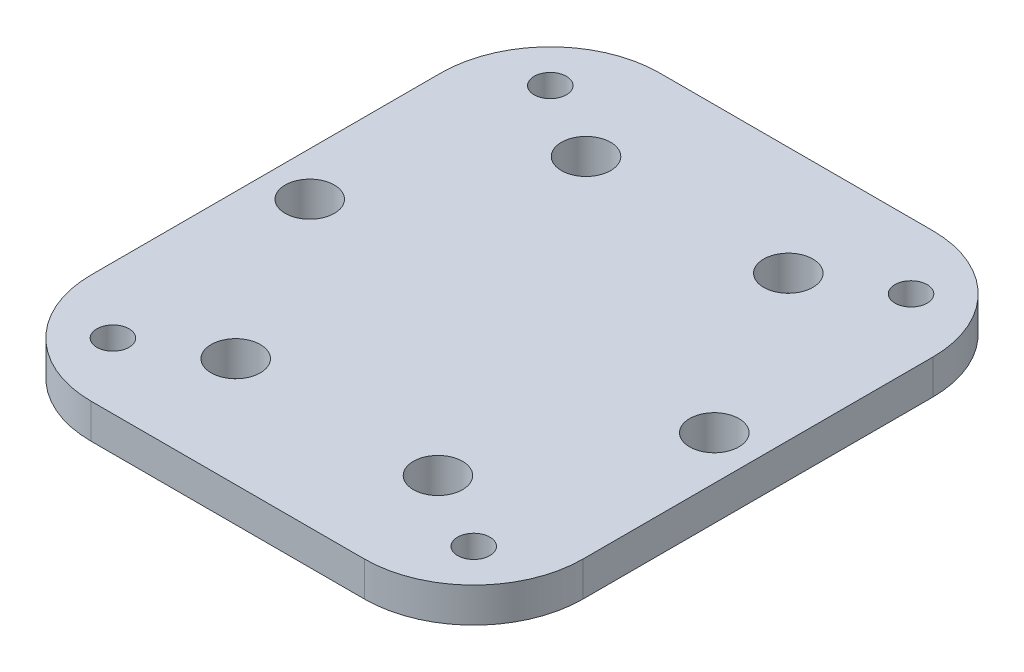
ISO-10303-21;
HEADER;
FILE_DESCRIPTION(('STEP AP214'),'2;1');
FILE_NAME('part.step','',(''),(''),'','','');
FILE_SCHEMA(('AUTOMOTIVE_DESIGN { 1 0 10303 214 1 1 1 1 }'));
ENDSEC;
DATA;
#1=APPLICATION_CONTEXT('core data for automotive mechanical design processes');
#2=APPLICATION_PROTOCOL_DEFINITION('international standard','automotive_design',2000,#1);
#3=PRODUCT_CONTEXT('',#1,'mechanical');
#4=PRODUCT('Part','Part','',(#3));
#5=PRODUCT_RELATED_PRODUCT_CATEGORY('part','',(#4));
#6=PRODUCT_DEFINITION_FORMATION('','',#4);
#7=PRODUCT_DEFINITION_CONTEXT('part definition',#1,'design');
#8=PRODUCT_DEFINITION('design','',#6,#7);
#9=PRODUCT_DEFINITION_SHAPE('','',#8);
#10=(LENGTH_UNIT() NAMED_UNIT(*) SI_UNIT(.MILLI.,.METRE.));
#11=(NAMED_UNIT(*) PLANE_ANGLE_UNIT() SI_UNIT($,.RADIAN.));
#12=(NAMED_UNIT(*) SI_UNIT($,.STERADIAN.) SOLID_ANGLE_UNIT());
#13=UNCERTAINTY_MEASURE_WITH_UNIT(LENGTH_MEASURE(1.E-05),#10,'distance_accuracy_value','');
#14=(GEOMETRIC_REPRESENTATION_CONTEXT(3) GLOBAL_UNCERTAINTY_ASSIGNED_CONTEXT((#13)) GLOBAL_UNIT_ASSIGNED_CONTEXT((#10,
#11,#12)) REPRESENTATION_CONTEXT('',''));
#15=CARTESIAN_POINT('',(0.,0.,0.));
#16=DIRECTION('',(0.,0.,1.));
#17=DIRECTION('',(1.,0.,0.));
#18=AXIS2_PLACEMENT_3D('',#15,#16,#17);
#19=CARTESIAN_POINT('',(-12.5,233.315,-16.));
#20=DIRECTION('',(0.,1.,0.));
#21=DIRECTION('',(0.,0.,1.));
#22=AXIS2_PLACEMENT_3D('',#19,#20,#21);
#23=CYLINDRICAL_SURFACE('',#22,10.);
#24=CARTESIAN_POINT('',(-12.5,236.49,-16.));
#25=DIRECTION('',(0.,1.,0.));
#26=DIRECTION('',(0.,0.,1.));
#27=AXIS2_PLACEMENT_3D('',#24,#25,#26);
#28=CIRCLE('',#27,10.);
#29=CARTESIAN_POINT('',(-12.4999999999999,236.49,-26.));
#30=VERTEX_POINT('',#29);
#31=CARTESIAN_POINT('',(-22.5,236.49,-15.9999999999999));
#32=VERTEX_POINT('',#31);
#33=EDGE_CURVE('E171',#30,#32,#28,.T.);
#34=ORIENTED_EDGE('',*,*,#33,.F.);
#35=DIRECTION('',(0.,1.,0.));
#36=VECTOR('',#35,1.);
#37=CARTESIAN_POINT('',(-12.4999999999999,233.315,-26.));
#38=LINE('',#37,#36);
#39=CARTESIAN_POINT('',(-12.4999999999999,233.315,-26.));
#40=VERTEX_POINT('',#39);
#41=EDGE_CURVE('E11',#40,#30,#38,.T.);
#42=ORIENTED_EDGE('',*,*,#41,.F.);
#43=CARTESIAN_POINT('',(-12.5,233.315,-16.));
#44=DIRECTION('',(0.,1.,0.));
#45=DIRECTION('',(0.,0.,1.));
#46=AXIS2_PLACEMENT_3D('',#43,#44,#45);
#47=CIRCLE('',#46,10.);
#48=CARTESIAN_POINT('',(-22.5,233.315,-15.9999999999999));
#49=VERTEX_POINT('',#48);
#50=EDGE_CURVE('E219',#40,#49,#47,.T.);
#51=ORIENTED_EDGE('',*,*,#50,.T.);
#52=DIRECTION('',(0.,1.,0.));
#53=VECTOR('',#52,1.);
#54=CARTESIAN_POINT('',(-22.5,233.315,-15.9999999999999));
#55=LINE('',#54,#53);
#56=EDGE_CURVE('E44',#49,#32,#55,.T.);
#57=ORIENTED_EDGE('',*,*,#56,.T.);
#58=EDGE_LOOP('',(#34,#42,#51,#57));
#59=FACE_BOUND('',#58,.T.);
#60=ADVANCED_FACE('F41',(#59),#23,.T.);
#61=CARTESIAN_POINT('',(0.,233.315,-26.));
#62=DIRECTION('',(0.,0.,1.));
#63=DIRECTION('',(1.,0.,0.));
#64=AXIS2_PLACEMENT_3D('',#61,#62,#63);
#65=PLANE('',#64);
#66=DIRECTION('',(1.,0.,0.));
#67=VECTOR('',#66,1.);
#68=CARTESIAN_POINT('',(0.,236.49,-26.));
#69=LINE('',#68,#67);
#70=CARTESIAN_POINT('',(12.4999999999999,236.49,-26.));
#71=VERTEX_POINT('',#70);
#72=EDGE_CURVE('E86',#30,#71,#69,.T.);
#73=ORIENTED_EDGE('',*,*,#72,.T.);
#74=DIRECTION('',(0.,1.,0.));
#75=VECTOR('',#74,1.);
#76=CARTESIAN_POINT('',(12.4999999999999,233.315,-26.));
#77=LINE('',#76,#75);
#78=CARTESIAN_POINT('',(12.4999999999999,233.315,-26.));
#79=VERTEX_POINT('',#78);
#80=EDGE_CURVE('E50',#79,#71,#77,.T.);
#81=ORIENTED_EDGE('',*,*,#80,.F.);
#82=DIRECTION('',(1.,0.,0.));
#83=VECTOR('',#82,1.);
#84=CARTESIAN_POINT('',(0.,233.315,-26.));
#85=LINE('',#84,#83);
#86=EDGE_CURVE('E119',#40,#79,#85,.T.);
#87=ORIENTED_EDGE('',*,*,#86,.F.);
#88=ORIENTED_EDGE('',*,*,#41,.T.);
#89=EDGE_LOOP('',(#73,#81,#87,#88));
#90=FACE_BOUND('',#89,.T.);
#91=ADVANCED_FACE('F261',(#90),#65,.F.);
#92=CARTESIAN_POINT('',(12.5,233.315,-16.));
#93=DIRECTION('',(0.,1.,0.));
#94=DIRECTION('',(0.,0.,1.));
#95=AXIS2_PLACEMENT_3D('',#92,#93,#94);
#96=CYLINDRICAL_SURFACE('',#95,10.);
#97=CARTESIAN_POINT('',(12.5,236.49,-16.));
#98=DIRECTION('',(0.,1.,0.));
#99=DIRECTION('',(0.,0.,1.));
#100=AXIS2_PLACEMENT_3D('',#97,#98,#99);
#101=CIRCLE('',#100,10.);
#102=CARTESIAN_POINT('',(22.5,236.49,-15.9999999999999));
#103=VERTEX_POINT('',#102);
#104=EDGE_CURVE('E126',#71,#103,#101,.F.);
#105=ORIENTED_EDGE('',*,*,#104,.T.);
#106=DIRECTION('',(0.,1.,0.));
#107=VECTOR('',#106,1.);
#108=CARTESIAN_POINT('',(22.5,233.315,-15.9999999999999));
#109=LINE('',#108,#107);
#110=CARTESIAN_POINT('',(22.5,233.315,-15.9999999999999));
#111=VERTEX_POINT('',#110);
#112=EDGE_CURVE('E123',#111,#103,#109,.T.);
#113=ORIENTED_EDGE('',*,*,#112,.F.);
#114=CARTESIAN_POINT('',(12.5,233.315,-16.));
#115=DIRECTION('',(0.,1.,0.));
#116=DIRECTION('',(0.,0.,1.));
#117=AXIS2_PLACEMENT_3D('',#114,#115,#116);
#118=CIRCLE('',#117,10.);
#119=EDGE_CURVE('E110',#79,#111,#118,.F.);
#120=ORIENTED_EDGE('',*,*,#119,.F.);
#121=ORIENTED_EDGE('',*,*,#80,.T.);
#122=EDGE_LOOP('',(#105,#113,#120,#121));
#123=FACE_BOUND('',#122,.T.);
#124=ADVANCED_FACE('F124',(#123),#96,.T.);
#125=CARTESIAN_POINT('',(22.5,233.315,0.));
#126=DIRECTION('',(-1.,0.,0.));
#127=DIRECTION('',(0.,0.,1.));
#128=AXIS2_PLACEMENT_3D('',#125,#126,#127);
#129=PLANE('',#128);
#130=DIRECTION('',(0.,0.,1.));
#131=VECTOR('',#130,1.);
#132=CARTESIAN_POINT('',(22.5,236.49,0.));
#133=LINE('',#132,#131);
#134=CARTESIAN_POINT('',(22.5,236.49,15.9999999999999));
#135=VERTEX_POINT('',#134);
#136=EDGE_CURVE('E186',#103,#135,#133,.T.);
#137=ORIENTED_EDGE('',*,*,#136,.T.);
#138=DIRECTION('',(0.,1.,0.));
#139=VECTOR('',#138,1.);
#140=CARTESIAN_POINT('',(22.5,233.315,15.9999999999999));
#141=LINE('',#140,#139);
#142=CARTESIAN_POINT('',(22.5,233.315,15.9999999999999));
#143=VERTEX_POINT('',#142);
#144=EDGE_CURVE('E130',#143,#135,#141,.T.);
#145=ORIENTED_EDGE('',*,*,#144,.F.);
#146=DIRECTION('',(0.,0.,1.));
#147=VECTOR('',#146,1.);
#148=CARTESIAN_POINT('',(22.5,233.315,0.));
#149=LINE('',#148,#147);
#150=EDGE_CURVE('E117',#111,#143,#149,.T.);
#151=ORIENTED_EDGE('',*,*,#150,.F.);
#152=ORIENTED_EDGE('',*,*,#112,.T.);
#153=EDGE_LOOP('',(#137,#145,#151,#152));
#154=FACE_BOUND('',#153,.T.);
#155=ADVANCED_FACE('F132',(#154),#129,.F.);
#156=CARTESIAN_POINT('',(12.5,233.315,16.));
#157=DIRECTION('',(0.,1.,0.));
#158=DIRECTION('',(0.,0.,1.));
#159=AXIS2_PLACEMENT_3D('',#156,#157,#158);
#160=CYLINDRICAL_SURFACE('',#159,10.);
#161=CARTESIAN_POINT('',(12.5,236.49,16.));
#162=DIRECTION('',(0.,1.,0.));
#163=DIRECTION('',(0.,0.,1.));
#164=AXIS2_PLACEMENT_3D('',#161,#162,#163);
#165=CIRCLE('',#164,10.);
#166=CARTESIAN_POINT('',(12.4999999999999,236.49,26.));
#167=VERTEX_POINT('',#166);
#168=EDGE_CURVE('E183',#167,#135,#165,.T.);
#169=ORIENTED_EDGE('',*,*,#168,.F.);
#170=DIRECTION('',(0.,1.,0.));
#171=VECTOR('',#170,1.);
#172=CARTESIAN_POINT('',(12.4999999999999,233.315,26.));
#173=LINE('',#172,#171);
#174=CARTESIAN_POINT('',(12.4999999999999,233.315,26.));
#175=VERTEX_POINT('',#174);
#176=EDGE_CURVE('E223',#175,#167,#173,.T.);
#177=ORIENTED_EDGE('',*,*,#176,.F.);
#178=CARTESIAN_POINT('',(12.5,233.315,16.));
#179=DIRECTION('',(0.,1.,0.));
#180=DIRECTION('',(0.,0.,1.));
#181=AXIS2_PLACEMENT_3D('',#178,#179,#180);
#182=CIRCLE('',#181,10.);
#183=EDGE_CURVE('E134',#175,#143,#182,.T.);
#184=ORIENTED_EDGE('',*,*,#183,.T.);
#185=ORIENTED_EDGE('',*,*,#144,.T.);
#186=EDGE_LOOP('',(#169,#177,#184,#185));
#187=FACE_BOUND('',#186,.T.);
#188=ADVANCED_FACE('F235',(#187),#160,.T.);
#189=CARTESIAN_POINT('',(0.,233.315,26.));
#190=DIRECTION('',(0.,0.,1.));
#191=DIRECTION('',(1.,0.,0.));
#192=AXIS2_PLACEMENT_3D('',#189,#190,#191);
#193=PLANE('',#192);
#194=DIRECTION('',(1.,0.,0.));
#195=VECTOR('',#194,1.);
#196=CARTESIAN_POINT('',(0.,236.49,26.));
#197=LINE('',#196,#195);
#198=CARTESIAN_POINT('',(-12.4999999999999,236.49,26.));
#199=VERTEX_POINT('',#198);
#200=EDGE_CURVE('E180',#199,#167,#197,.T.);
#201=ORIENTED_EDGE('',*,*,#200,.F.);
#202=DIRECTION('',(0.,1.,0.));
#203=VECTOR('',#202,1.);
#204=CARTESIAN_POINT('',(-12.4999999999999,233.315,26.));
#205=LINE('',#204,#203);
#206=CARTESIAN_POINT('',(-12.4999999999999,233.315,26.));
#207=VERTEX_POINT('',#206);
#208=EDGE_CURVE('E225',#207,#199,#205,.T.);
#209=ORIENTED_EDGE('',*,*,#208,.F.);
#210=DIRECTION('',(1.,0.,0.));
#211=VECTOR('',#210,1.);
#212=CARTESIAN_POINT('',(0.,233.315,26.));
#213=LINE('',#212,#211);
#214=EDGE_CURVE('E136',#207,#175,#213,.T.);
#215=ORIENTED_EDGE('',*,*,#214,.T.);
#216=ORIENTED_EDGE('',*,*,#176,.T.);
#217=EDGE_LOOP('',(#201,#209,#215,#216));
#218=FACE_BOUND('',#217,.T.);
#219=ADVANCED_FACE('F241',(#218),#193,.T.);
#220=CARTESIAN_POINT('',(-12.5,233.315,16.));
#221=DIRECTION('',(0.,1.,0.));
#222=DIRECTION('',(0.,0.,1.));
#223=AXIS2_PLACEMENT_3D('',#220,#221,#222);
#224=CYLINDRICAL_SURFACE('',#223,9.99999999999999);
#225=CARTESIAN_POINT('',(-12.5,236.49,16.));
#226=DIRECTION('',(0.,1.,0.));
#227=DIRECTION('',(0.,0.,1.));
#228=AXIS2_PLACEMENT_3D('',#225,#226,#227);
#229=CIRCLE('',#228,9.99999999999999);
#230=CARTESIAN_POINT('',(-22.5,236.49,16.));
#231=VERTEX_POINT('',#230);
#232=EDGE_CURVE('E177',#231,#199,#229,.T.);
#233=ORIENTED_EDGE('',*,*,#232,.F.);
#234=DIRECTION('',(0.,1.,0.));
#235=VECTOR('',#234,1.);
#236=CARTESIAN_POINT('',(-22.5,233.315,16.));
#237=LINE('',#236,#235);
#238=CARTESIAN_POINT('',(-22.5,233.315,16.));
#239=VERTEX_POINT('',#238);
#240=EDGE_CURVE('E226',#239,#231,#237,.T.);
#241=ORIENTED_EDGE('',*,*,#240,.F.);
#242=CARTESIAN_POINT('',(-12.5,233.315,16.));
#243=DIRECTION('',(0.,1.,0.));
#244=DIRECTION('',(0.,0.,1.));
#245=AXIS2_PLACEMENT_3D('',#242,#243,#244);
#246=CIRCLE('',#245,9.99999999999999);
#247=EDGE_CURVE('E242',#239,#207,#246,.T.);
#248=ORIENTED_EDGE('',*,*,#247,.T.);
#249=ORIENTED_EDGE('',*,*,#208,.T.);
#250=EDGE_LOOP('',(#233,#241,#248,#249));
#251=FACE_BOUND('',#250,.T.);
#252=ADVANCED_FACE('F248',(#251),#224,.T.);
#253=CARTESIAN_POINT('',(-16.5,233.315,20.));
#254=DIRECTION('',(0.,1.,0.));
#255=DIRECTION('',(0.,0.,1.));
#256=AXIS2_PLACEMENT_3D('',#253,#254,#255);
#257=CYLINDRICAL_SURFACE('',#256,1.47319999999999);
#258=CARTESIAN_POINT('',(-16.5,233.315,20.));
#259=DIRECTION('',(0.,1.,0.));
#260=DIRECTION('',(0.,0.,1.));
#261=AXIS2_PLACEMENT_3D('',#258,#259,#260);
#262=CIRCLE('',#261,1.47319999999999);
#263=CARTESIAN_POINT('',(-16.5,233.315,21.4732));
#264=VERTEX_POINT('',#263);
#265=EDGE_CURVE('E165',#264,#264,#262,.T.);
#266=ORIENTED_EDGE('',*,*,#265,.F.);
#267=EDGE_LOOP('',(#266));
#268=FACE_BOUND('',#267,.T.);
#269=CARTESIAN_POINT('',(-16.5,236.49,20.));
#270=DIRECTION('',(0.,1.,0.));
#271=DIRECTION('',(0.,0.,1.));
#272=AXIS2_PLACEMENT_3D('',#269,#270,#271);
#273=CIRCLE('',#272,1.47319999999999);
#274=CARTESIAN_POINT('',(-16.5,236.49,21.4732));
#275=VERTEX_POINT('',#274);
#276=EDGE_CURVE('E214',#275,#275,#273,.T.);
#277=ORIENTED_EDGE('',*,*,#276,.T.);
#278=EDGE_LOOP('',(#277));
#279=FACE_BOUND('',#278,.T.);
#280=ADVANCED_FACE('F250',(#268,#279),#257,.F.);
#281=CARTESIAN_POINT('',(-18.4999999999991,233.315,1.68829830522852E-12));
#282=DIRECTION('',(0.,1.,0.));
#283=DIRECTION('',(0.,0.,1.));
#284=AXIS2_PLACEMENT_3D('',#281,#282,#283);
#285=CYLINDRICAL_SURFACE('',#284,2.25000000000184);
#286=CARTESIAN_POINT('',(-18.4999999999991,233.315,1.68829830522852E-12));
#287=DIRECTION('',(0.,1.,0.));
#288=DIRECTION('',(0.,0.,1.));
#289=AXIS2_PLACEMENT_3D('',#286,#287,#288);
#290=CIRCLE('',#289,2.25000000000184);
#291=CARTESIAN_POINT('',(-18.4999999999991,233.315,2.25000000000353));
#292=VERTEX_POINT('',#291);
#293=EDGE_CURVE('E162',#292,#292,#290,.T.);
#294=ORIENTED_EDGE('',*,*,#293,.F.);
#295=EDGE_LOOP('',(#294));
#296=FACE_BOUND('',#295,.T.);
#297=CARTESIAN_POINT('',(-18.4999999999991,236.49,1.68829830522852E-12));
#298=DIRECTION('',(0.,1.,0.));
#299=DIRECTION('',(0.,0.,1.));
#300=AXIS2_PLACEMENT_3D('',#297,#298,#299);
#301=CIRCLE('',#300,2.25000000000184);
#302=CARTESIAN_POINT('',(-18.4999999999991,236.49,2.25000000000353));
#303=VERTEX_POINT('',#302);
#304=EDGE_CURVE('E211',#303,#303,#301,.T.);
#305=ORIENTED_EDGE('',*,*,#304,.T.);
#306=EDGE_LOOP('',(#305));
#307=FACE_BOUND('',#306,.T.);
#308=ADVANCED_FACE('F256',(#296,#307),#285,.F.);
#309=CARTESIAN_POINT('',(-9.2499999999981,233.315,16.0214699700132));
#310=DIRECTION('',(0.,1.,0.));
#311=DIRECTION('',(0.,0.,1.));
#312=AXIS2_PLACEMENT_3D('',#309,#310,#311);
#313=CYLINDRICAL_SURFACE('',#312,2.25000000000151);
#314=CARTESIAN_POINT('',(-9.2499999999981,233.315,16.0214699700132));
#315=DIRECTION('',(0.,1.,0.));
#316=DIRECTION('',(0.,0.,1.));
#317=AXIS2_PLACEMENT_3D('',#314,#315,#316);
#318=CIRCLE('',#317,2.25000000000151);
#319=CARTESIAN_POINT('',(-9.2499999999981,233.315,18.2714699700147));
#320=VERTEX_POINT('',#319);
#321=EDGE_CURVE('E159',#320,#320,#318,.T.);
#322=ORIENTED_EDGE('',*,*,#321,.F.);
#323=EDGE_LOOP('',(#322));
#324=FACE_BOUND('',#323,.T.);
#325=CARTESIAN_POINT('',(-9.2499999999981,236.49,16.0214699700132));
#326=DIRECTION('',(0.,1.,0.));
#327=DIRECTION('',(0.,0.,1.));
#328=AXIS2_PLACEMENT_3D('',#325,#326,#327);
#329=CIRCLE('',#328,2.25000000000151);
#330=CARTESIAN_POINT('',(-9.2499999999981,236.49,18.2714699700147));
#331=VERTEX_POINT('',#330);
#332=EDGE_CURVE('E208',#331,#331,#329,.T.);
#333=ORIENTED_EDGE('',*,*,#332,.T.);
#334=EDGE_LOOP('',(#333));
#335=FACE_BOUND('',#334,.T.);
#336=ADVANCED_FACE('F307',(#324,#335),#313,.F.);
#337=CARTESIAN_POINT('',(-9.25000000000011,233.315,-16.021469970011));
#338=DIRECTION('',(0.,1.,0.));
#339=DIRECTION('',(0.,0.,1.));
#340=AXIS2_PLACEMENT_3D('',#337,#338,#339);
#341=CYLINDRICAL_SURFACE('',#340,2.25000000000118);
#342=CARTESIAN_POINT('',(-9.25000000000011,233.315,-16.021469970011));
#343=DIRECTION('',(0.,1.,0.));
#344=DIRECTION('',(0.,0.,1.));
#345=AXIS2_PLACEMENT_3D('',#342,#343,#344);
#346=CIRCLE('',#345,2.25000000000118);
#347=CARTESIAN_POINT('',(-9.25000000000011,233.315,-13.7714699700098));
#348=VERTEX_POINT('',#347);
#349=EDGE_CURVE('E156',#348,#348,#346,.T.);
#350=ORIENTED_EDGE('',*,*,#349,.F.);
#351=EDGE_LOOP('',(#350));
#352=FACE_BOUND('',#351,.T.);
#353=CARTESIAN_POINT('',(-9.25000000000011,236.49,-16.021469970011));
#354=DIRECTION('',(0.,1.,0.));
#355=DIRECTION('',(0.,0.,1.));
#356=AXIS2_PLACEMENT_3D('',#353,#354,#355);
#357=CIRCLE('',#356,2.25000000000118);
#358=CARTESIAN_POINT('',(-9.25000000000011,236.49,-13.7714699700098));
#359=VERTEX_POINT('',#358);
#360=EDGE_CURVE('E205',#359,#359,#357,.T.);
#361=ORIENTED_EDGE('',*,*,#360,.T.);
#362=EDGE_LOOP('',(#361));
#363=FACE_BOUND('',#362,.T.);
#364=ADVANCED_FACE('F318',(#352,#363),#341,.F.);
#365=CARTESIAN_POINT('',(16.5,233.315,20.));
#366=DIRECTION('',(0.,1.,0.));
#367=DIRECTION('',(0.,0.,1.));
#368=AXIS2_PLACEMENT_3D('',#365,#366,#367);
#369=CYLINDRICAL_SURFACE('',#368,1.4732);
#370=CARTESIAN_POINT('',(16.5,233.315,20.));
#371=DIRECTION('',(0.,1.,0.));
#372=DIRECTION('',(0.,0.,1.));
#373=AXIS2_PLACEMENT_3D('',#370,#371,#372);
#374=CIRCLE('',#373,1.4732);
#375=CARTESIAN_POINT('',(16.5,233.315,21.4732));
#376=VERTEX_POINT('',#375);
#377=EDGE_CURVE('E153',#376,#376,#374,.T.);
#378=ORIENTED_EDGE('',*,*,#377,.F.);
#379=EDGE_LOOP('',(#378));
#380=FACE_BOUND('',#379,.T.);
#381=CARTESIAN_POINT('',(16.5,236.49,20.));
#382=DIRECTION('',(0.,1.,0.));
#383=DIRECTION('',(0.,0.,1.));
#384=AXIS2_PLACEMENT_3D('',#381,#382,#383);
#385=CIRCLE('',#384,1.4732);
#386=CARTESIAN_POINT('',(16.5,236.49,21.4732));
#387=VERTEX_POINT('',#386);
#388=EDGE_CURVE('E202',#387,#387,#385,.T.);
#389=ORIENTED_EDGE('',*,*,#388,.T.);
#390=EDGE_LOOP('',(#389));
#391=FACE_BOUND('',#390,.T.);
#392=ADVANCED_FACE('F329',(#380,#391),#369,.F.);
#393=CARTESIAN_POINT('',(16.5,233.315,-20.));
#394=DIRECTION('',(0.,1.,0.));
#395=DIRECTION('',(0.,0.,1.));
#396=AXIS2_PLACEMENT_3D('',#393,#394,#395);
#397=CYLINDRICAL_SURFACE('',#396,1.4732);
#398=CARTESIAN_POINT('',(16.5,233.315,-20.));
#399=DIRECTION('',(0.,1.,0.));
#400=DIRECTION('',(0.,0.,1.));
#401=AXIS2_PLACEMENT_3D('',#398,#399,#400);
#402=CIRCLE('',#401,1.4732);
#403=CARTESIAN_POINT('',(16.5,233.315,-18.5268));
#404=VERTEX_POINT('',#403);
#405=EDGE_CURVE('E150',#404,#404,#402,.T.);
#406=ORIENTED_EDGE('',*,*,#405,.F.);
#407=EDGE_LOOP('',(#406));
#408=FACE_BOUND('',#407,.T.);
#409=CARTESIAN_POINT('',(16.5,236.49,-20.));
#410=DIRECTION('',(0.,1.,0.));
#411=DIRECTION('',(0.,0.,1.));
#412=AXIS2_PLACEMENT_3D('',#409,#410,#411);
#413=CIRCLE('',#412,1.4732);
#414=CARTESIAN_POINT('',(16.5,236.49,-18.5268));
#415=VERTEX_POINT('',#414);
#416=EDGE_CURVE('E199',#415,#415,#413,.T.);
#417=ORIENTED_EDGE('',*,*,#416,.T.);
#418=EDGE_LOOP('',(#417));
#419=FACE_BOUND('',#418,.T.);
#420=ADVANCED_FACE('F340',(#408,#419),#397,.F.);
#421=CARTESIAN_POINT('',(9.25000000000191,233.315,16.0214699700121));
#422=DIRECTION('',(0.,1.,0.));
#423=DIRECTION('',(0.,0.,1.));
#424=AXIS2_PLACEMENT_3D('',#421,#422,#423);
#425=CYLINDRICAL_SURFACE('',#424,2.25000000000046);
#426=CARTESIAN_POINT('',(9.25000000000191,233.315,16.0214699700121));
#427=DIRECTION('',(0.,1.,0.));
#428=DIRECTION('',(0.,0.,1.));
#429=AXIS2_PLACEMENT_3D('',#426,#427,#428);
#430=CIRCLE('',#429,2.25000000000046);
#431=CARTESIAN_POINT('',(9.25000000000191,233.315,18.2714699700125));
#432=VERTEX_POINT('',#431);
#433=EDGE_CURVE('E147',#432,#432,#430,.T.);
#434=ORIENTED_EDGE('',*,*,#433,.F.);
#435=EDGE_LOOP('',(#434));
#436=FACE_BOUND('',#435,.T.);
#437=CARTESIAN_POINT('',(9.25000000000191,236.49,16.0214699700121));
#438=DIRECTION('',(0.,1.,0.));
#439=DIRECTION('',(0.,0.,1.));
#440=AXIS2_PLACEMENT_3D('',#437,#438,#439);
#441=CIRCLE('',#440,2.25000000000046);
#442=CARTESIAN_POINT('',(9.25000000000191,236.49,18.2714699700125));
#443=VERTEX_POINT('',#442);
#444=EDGE_CURVE('E196',#443,#443,#441,.T.);
#445=ORIENTED_EDGE('',*,*,#444,.T.);
#446=EDGE_LOOP('',(#445));
#447=FACE_BOUND('',#446,.T.);
#448=ADVANCED_FACE('F351',(#436,#447),#425,.F.);
#449=CARTESIAN_POINT('',(18.5000000000009,233.315,-6.39585606698739E-13));
#450=DIRECTION('',(0.,1.,0.));
#451=DIRECTION('',(0.,0.,1.));
#452=AXIS2_PLACEMENT_3D('',#449,#450,#451);
#453=CYLINDRICAL_SURFACE('',#452,2.24999999999973);
#454=CARTESIAN_POINT('',(18.5000000000009,233.315,-6.39585606698739E-13));
#455=DIRECTION('',(0.,1.,0.));
#456=DIRECTION('',(0.,0.,1.));
#457=AXIS2_PLACEMENT_3D('',#454,#455,#456);
#458=CIRCLE('',#457,2.24999999999973);
#459=CARTESIAN_POINT('',(18.5000000000009,233.315,2.24999999999909));
#460=VERTEX_POINT('',#459);
#461=EDGE_CURVE('E144',#460,#460,#458,.T.);
#462=ORIENTED_EDGE('',*,*,#461,.F.);
#463=EDGE_LOOP('',(#462));
#464=FACE_BOUND('',#463,.T.);
#465=CARTESIAN_POINT('',(18.5000000000009,236.49,-6.39585606698739E-13));
#466=DIRECTION('',(0.,1.,0.));
#467=DIRECTION('',(0.,0.,1.));
#468=AXIS2_PLACEMENT_3D('',#465,#466,#467);
#469=CIRCLE('',#468,2.24999999999973);
#470=CARTESIAN_POINT('',(18.5000000000009,236.49,2.24999999999909));
#471=VERTEX_POINT('',#470);
#472=EDGE_CURVE('E193',#471,#471,#469,.T.);
#473=ORIENTED_EDGE('',*,*,#472,.T.);
#474=EDGE_LOOP('',(#473));
#475=FACE_BOUND('',#474,.T.);
#476=ADVANCED_FACE('F362',(#464,#475),#453,.F.);
#477=CARTESIAN_POINT('',(9.24999999999991,233.315,-16.0214699700122));
#478=DIRECTION('',(0.,1.,0.));
#479=DIRECTION('',(0.,0.,1.));
#480=AXIS2_PLACEMENT_3D('',#477,#478,#479);
#481=CYLINDRICAL_SURFACE('',#480,2.25);
#482=CARTESIAN_POINT('',(9.24999999999991,233.315,-16.0214699700122));
#483=DIRECTION('',(0.,1.,0.));
#484=DIRECTION('',(0.,0.,1.));
#485=AXIS2_PLACEMENT_3D('',#482,#483,#484);
#486=CIRCLE('',#485,2.25);
#487=CARTESIAN_POINT('',(9.24999999999991,233.315,-13.7714699700122));
#488=VERTEX_POINT('',#487);
#489=EDGE_CURVE('E141',#488,#488,#486,.T.);
#490=ORIENTED_EDGE('',*,*,#489,.F.);
#491=EDGE_LOOP('',(#490));
#492=FACE_BOUND('',#491,.T.);
#493=CARTESIAN_POINT('',(9.24999999999991,236.49,-16.0214699700122));
#494=DIRECTION('',(0.,1.,0.));
#495=DIRECTION('',(0.,0.,1.));
#496=AXIS2_PLACEMENT_3D('',#493,#494,#495);
#497=CIRCLE('',#496,2.25);
#498=CARTESIAN_POINT('',(9.24999999999991,236.49,-13.7714699700122));
#499=VERTEX_POINT('',#498);
#500=EDGE_CURVE('E190',#499,#499,#497,.T.);
#501=ORIENTED_EDGE('',*,*,#500,.T.);
#502=EDGE_LOOP('',(#501));
#503=FACE_BOUND('',#502,.T.);
#504=ADVANCED_FACE('F271',(#492,#503),#481,.F.);
#505=CARTESIAN_POINT('',(-22.5,233.315,0.));
#506=DIRECTION('',(-1.,0.,0.));
#507=DIRECTION('',(0.,0.,1.));
#508=AXIS2_PLACEMENT_3D('',#505,#506,#507);
#509=PLANE('',#508);
#510=DIRECTION('',(0.,0.,1.));
#511=VECTOR('',#510,1.);
#512=CARTESIAN_POINT('',(-22.5,236.49,0.));
#513=LINE('',#512,#511);
#514=EDGE_CURVE('E174',#32,#231,#513,.T.);
#515=ORIENTED_EDGE('',*,*,#514,.F.);
#516=ORIENTED_EDGE('',*,*,#56,.F.);
#517=DIRECTION('',(0.,0.,1.));
#518=VECTOR('',#517,1.);
#519=CARTESIAN_POINT('',(-22.5,233.315,0.));
#520=LINE('',#519,#518);
#521=EDGE_CURVE('E243',#49,#239,#520,.T.);
#522=ORIENTED_EDGE('',*,*,#521,.T.);
#523=ORIENTED_EDGE('',*,*,#240,.T.);
#524=EDGE_LOOP('',(#515,#516,#522,#523));
#525=FACE_BOUND('',#524,.T.);
#526=ADVANCED_FACE('F228',(#525),#509,.T.);
#527=CARTESIAN_POINT('',(-16.5,233.315,-20.));
#528=DIRECTION('',(0.,1.,0.));
#529=DIRECTION('',(0.,0.,1.));
#530=AXIS2_PLACEMENT_3D('',#527,#528,#529);
#531=CYLINDRICAL_SURFACE('',#530,1.47319999999999);
#532=CARTESIAN_POINT('',(-16.5,233.315,-20.));
#533=DIRECTION('',(0.,1.,0.));
#534=DIRECTION('',(0.,0.,1.));
#535=AXIS2_PLACEMENT_3D('',#532,#533,#534);
#536=CIRCLE('',#535,1.47319999999999);
#537=CARTESIAN_POINT('',(-16.5,233.315,-18.5268));
#538=VERTEX_POINT('',#537);
#539=EDGE_CURVE('E168',#538,#538,#536,.T.);
#540=ORIENTED_EDGE('',*,*,#539,.F.);
#541=EDGE_LOOP('',(#540));
#542=FACE_BOUND('',#541,.T.);
#543=CARTESIAN_POINT('',(-16.5,236.49,-20.));
#544=DIRECTION('',(0.,1.,0.));
#545=DIRECTION('',(0.,0.,1.));
#546=AXIS2_PLACEMENT_3D('',#543,#544,#545);
#547=CIRCLE('',#546,1.47319999999999);
#548=CARTESIAN_POINT('',(-16.5,236.49,-18.5268));
#549=VERTEX_POINT('',#548);
#550=EDGE_CURVE('E217',#549,#549,#547,.T.);
#551=ORIENTED_EDGE('',*,*,#550,.T.);
#552=EDGE_LOOP('',(#551));
#553=FACE_BOUND('',#552,.T.);
#554=ADVANCED_FACE('F391',(#542,#553),#531,.F.);
#555=CARTESIAN_POINT('',(0.,233.315,0.));
#556=DIRECTION('',(0.,1.,0.));
#557=DIRECTION('',(0.,0.,1.));
#558=AXIS2_PLACEMENT_3D('',#555,#556,#557);
#559=PLANE('',#558);
#560=ORIENTED_EDGE('',*,*,#50,.F.);
#561=ORIENTED_EDGE('',*,*,#86,.T.);
#562=ORIENTED_EDGE('',*,*,#119,.T.);
#563=ORIENTED_EDGE('',*,*,#150,.T.);
#564=ORIENTED_EDGE('',*,*,#183,.F.);
#565=ORIENTED_EDGE('',*,*,#214,.F.);
#566=ORIENTED_EDGE('',*,*,#247,.F.);
#567=ORIENTED_EDGE('',*,*,#521,.F.);
#568=EDGE_LOOP('',(#560,#561,#562,#563,#564,#565,#566,#567));
#569=FACE_BOUND('',#568,.T.);
#570=ORIENTED_EDGE('',*,*,#489,.T.);
#571=EDGE_LOOP('',(#570));
#572=FACE_BOUND('',#571,.T.);
#573=ORIENTED_EDGE('',*,*,#461,.T.);
#574=EDGE_LOOP('',(#573));
#575=FACE_BOUND('',#574,.T.);
#576=ORIENTED_EDGE('',*,*,#433,.T.);
#577=EDGE_LOOP('',(#576));
#578=FACE_BOUND('',#577,.T.);
#579=ORIENTED_EDGE('',*,*,#405,.T.);
#580=EDGE_LOOP('',(#579));
#581=FACE_BOUND('',#580,.T.);
#582=ORIENTED_EDGE('',*,*,#377,.T.);
#583=EDGE_LOOP('',(#582));
#584=FACE_BOUND('',#583,.T.);
#585=ORIENTED_EDGE('',*,*,#349,.T.);
#586=EDGE_LOOP('',(#585));
#587=FACE_BOUND('',#586,.T.);
#588=ORIENTED_EDGE('',*,*,#321,.T.);
#589=EDGE_LOOP('',(#588));
#590=FACE_BOUND('',#589,.T.);
#591=ORIENTED_EDGE('',*,*,#293,.T.);
#592=EDGE_LOOP('',(#591));
#593=FACE_BOUND('',#592,.T.);
#594=ORIENTED_EDGE('',*,*,#265,.T.);
#595=EDGE_LOOP('',(#594));
#596=FACE_BOUND('',#595,.T.);
#597=ORIENTED_EDGE('',*,*,#539,.T.);
#598=EDGE_LOOP('',(#597));
#599=FACE_BOUND('',#598,.T.);
#600=ADVANCED_FACE('F113',(#569,#572,#575,#578,#581,#584,#587,#590,#593,#596,#599),#559,.F.);
#601=CARTESIAN_POINT('',(0.,236.49,0.));
#602=DIRECTION('',(0.,1.,0.));
#603=DIRECTION('',(0.,0.,1.));
#604=AXIS2_PLACEMENT_3D('',#601,#602,#603);
#605=PLANE('',#604);
#606=ORIENTED_EDGE('',*,*,#33,.T.);
#607=ORIENTED_EDGE('',*,*,#514,.T.);
#608=ORIENTED_EDGE('',*,*,#232,.T.);
#609=ORIENTED_EDGE('',*,*,#200,.T.);
#610=ORIENTED_EDGE('',*,*,#168,.T.);
#611=ORIENTED_EDGE('',*,*,#136,.F.);
#612=ORIENTED_EDGE('',*,*,#104,.F.);
#613=ORIENTED_EDGE('',*,*,#72,.F.);
#614=EDGE_LOOP('',(#606,#607,#608,#609,#610,#611,#612,#613));
#615=FACE_BOUND('',#614,.T.);
#616=ORIENTED_EDGE('',*,*,#500,.F.);
#617=EDGE_LOOP('',(#616));
#618=FACE_BOUND('',#617,.T.);
#619=ORIENTED_EDGE('',*,*,#472,.F.);
#620=EDGE_LOOP('',(#619));
#621=FACE_BOUND('',#620,.T.);
#622=ORIENTED_EDGE('',*,*,#444,.F.);
#623=EDGE_LOOP('',(#622));
#624=FACE_BOUND('',#623,.T.);
#625=ORIENTED_EDGE('',*,*,#416,.F.);
#626=EDGE_LOOP('',(#625));
#627=FACE_BOUND('',#626,.T.);
#628=ORIENTED_EDGE('',*,*,#388,.F.);
#629=EDGE_LOOP('',(#628));
#630=FACE_BOUND('',#629,.T.);
#631=ORIENTED_EDGE('',*,*,#360,.F.);
#632=EDGE_LOOP('',(#631));
#633=FACE_BOUND('',#632,.T.);
#634=ORIENTED_EDGE('',*,*,#332,.F.);
#635=EDGE_LOOP('',(#634));
#636=FACE_BOUND('',#635,.T.);
#637=ORIENTED_EDGE('',*,*,#304,.F.);
#638=EDGE_LOOP('',(#637));
#639=FACE_BOUND('',#638,.T.);
#640=ORIENTED_EDGE('',*,*,#276,.F.);
#641=EDGE_LOOP('',(#640));
#642=FACE_BOUND('',#641,.T.);
#643=ORIENTED_EDGE('',*,*,#550,.F.);
#644=EDGE_LOOP('',(#643));
#645=FACE_BOUND('',#644,.T.);
#646=ADVANCED_FACE('F230',(#615,#618,#621,#624,#627,#630,#633,#636,#639,#642,#645),#605,.T.);
#647=CLOSED_SHELL('',(#60,#91,#124,#155,#188,#219,#252,#280,#308,#336,#364,#392,#420,#448,#476,
#504,#526,#554,#600,#646));
#648=MANIFOLD_SOLID_BREP('B2',#647);
#649=ADVANCED_BREP_SHAPE_REPRESENTATION('',(#18,#648),#14);
#650=SHAPE_DEFINITION_REPRESENTATION(#9,#649);
ENDSEC;
END-ISO-10303-21;
